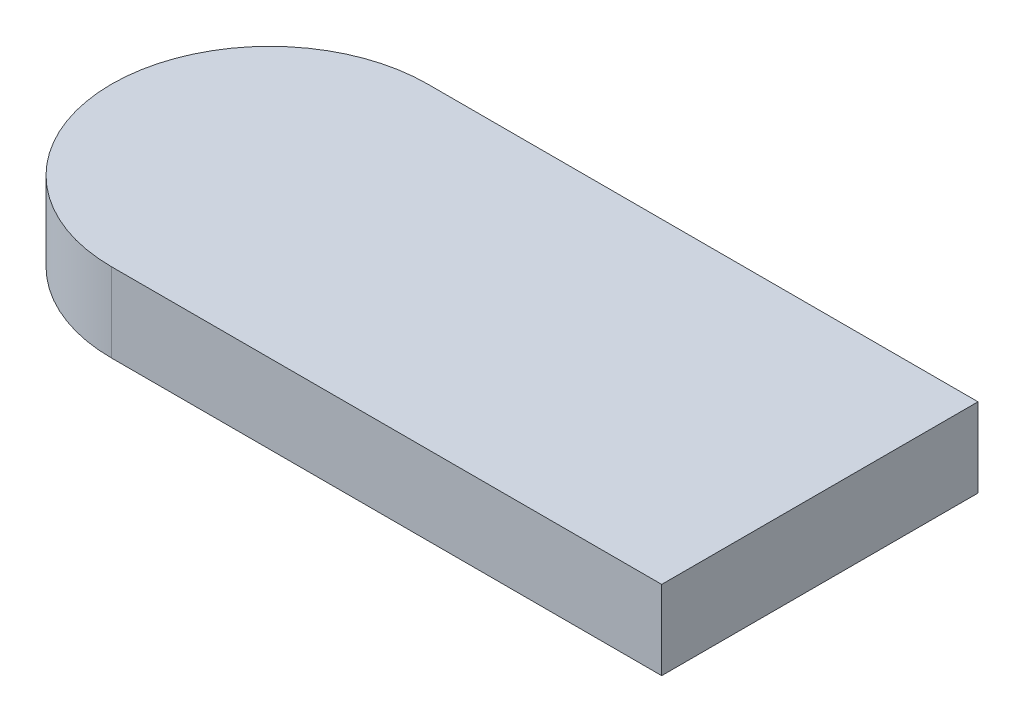
ISO-10303-21;
HEADER;
FILE_DESCRIPTION(('STEP AP214'),'2;1');
FILE_NAME('part.step','',(''),(''),'','','');
FILE_SCHEMA(('AUTOMOTIVE_DESIGN { 1 0 10303 214 1 1 1 1 }'));
ENDSEC;
DATA;
#1=APPLICATION_CONTEXT('core data for automotive mechanical design processes');
#2=APPLICATION_PROTOCOL_DEFINITION('international standard','automotive_design',2000,#1);
#3=PRODUCT_CONTEXT('',#1,'mechanical');
#4=PRODUCT('Part','Part','',(#3));
#5=PRODUCT_RELATED_PRODUCT_CATEGORY('part','',(#4));
#6=PRODUCT_DEFINITION_FORMATION('','',#4);
#7=PRODUCT_DEFINITION_CONTEXT('part definition',#1,'design');
#8=PRODUCT_DEFINITION('design','',#6,#7);
#9=PRODUCT_DEFINITION_SHAPE('','',#8);
#10=(LENGTH_UNIT() NAMED_UNIT(*) SI_UNIT(.MILLI.,.METRE.));
#11=(NAMED_UNIT(*) PLANE_ANGLE_UNIT() SI_UNIT($,.RADIAN.));
#12=(NAMED_UNIT(*) SI_UNIT($,.STERADIAN.) SOLID_ANGLE_UNIT());
#13=UNCERTAINTY_MEASURE_WITH_UNIT(LENGTH_MEASURE(1.E-05),#10,'distance_accuracy_value','');
#14=(GEOMETRIC_REPRESENTATION_CONTEXT(3) GLOBAL_UNCERTAINTY_ASSIGNED_CONTEXT((#13)) GLOBAL_UNIT_ASSIGNED_CONTEXT((#10,
#11,#12)) REPRESENTATION_CONTEXT('',''));
#15=CARTESIAN_POINT('',(0.,0.,0.));
#16=DIRECTION('',(0.,0.,1.));
#17=DIRECTION('',(1.,0.,0.));
#18=AXIS2_PLACEMENT_3D('',#15,#16,#17);
#19=CARTESIAN_POINT('',(20.77,5.97,11.94));
#20=DIRECTION('',(-1.,0.,0.));
#21=DIRECTION('',(0.,0.,1.));
#22=AXIS2_PLACEMENT_3D('',#19,#20,#21);
#23=PLANE('',#22);
#24=DIRECTION('',(0.,0.,-1.));
#25=VECTOR('',#24,1.);
#26=CARTESIAN_POINT('',(20.77,0.,11.94));
#27=LINE('',#26,#25);
#28=CARTESIAN_POINT('',(20.77,0.,11.94));
#29=VERTEX_POINT('',#28);
#30=CARTESIAN_POINT('',(20.77,0.,-11.94));
#31=VERTEX_POINT('',#30);
#32=EDGE_CURVE('E105',#29,#31,#27,.T.);
#33=ORIENTED_EDGE('',*,*,#32,.T.);
#34=DIRECTION('',(0.,-1.,0.));
#35=VECTOR('',#34,1.);
#36=CARTESIAN_POINT('',(20.77,5.97,-11.94));
#37=LINE('',#36,#35);
#38=CARTESIAN_POINT('',(20.77,5.97,-11.94));
#39=VERTEX_POINT('',#38);
#40=EDGE_CURVE('E11',#39,#31,#37,.T.);
#41=ORIENTED_EDGE('',*,*,#40,.F.);
#42=DIRECTION('',(0.,0.,-1.));
#43=VECTOR('',#42,1.);
#44=CARTESIAN_POINT('',(20.77,5.97,11.94));
#45=LINE('',#44,#43);
#46=CARTESIAN_POINT('',(20.77,5.97,11.94));
#47=VERTEX_POINT('',#46);
#48=EDGE_CURVE('E89',#47,#39,#45,.T.);
#49=ORIENTED_EDGE('',*,*,#48,.F.);
#50=DIRECTION('',(0.,-1.,0.));
#51=VECTOR('',#50,1.);
#52=CARTESIAN_POINT('',(20.77,5.97,11.94));
#53=LINE('',#52,#51);
#54=EDGE_CURVE('E98',#47,#29,#53,.T.);
#55=ORIENTED_EDGE('',*,*,#54,.T.);
#56=EDGE_LOOP('',(#33,#41,#49,#55));
#57=FACE_BOUND('',#56,.T.);
#58=ADVANCED_FACE('F39',(#57),#23,.F.);
#59=CARTESIAN_POINT('',(-20.77,5.97,-11.94));
#60=DIRECTION('',(0.,0.,1.));
#61=DIRECTION('',(1.,0.,0.));
#62=AXIS2_PLACEMENT_3D('',#59,#60,#61);
#63=PLANE('',#62);
#64=DIRECTION('',(-1.,0.,0.));
#65=VECTOR('',#64,1.);
#66=CARTESIAN_POINT('',(-20.77,0.,-11.94));
#67=LINE('',#66,#65);
#68=CARTESIAN_POINT('',(-20.77,0.,-11.94));
#69=VERTEX_POINT('',#68);
#70=EDGE_CURVE('E94',#31,#69,#67,.T.);
#71=ORIENTED_EDGE('',*,*,#70,.T.);
#72=DIRECTION('',(0.,-1.,0.));
#73=VECTOR('',#72,1.);
#74=CARTESIAN_POINT('',(-20.77,5.97,-11.94));
#75=LINE('',#74,#73);
#76=CARTESIAN_POINT('',(-20.77,5.97,-11.94));
#77=VERTEX_POINT('',#76);
#78=EDGE_CURVE('E50',#77,#69,#75,.T.);
#79=ORIENTED_EDGE('',*,*,#78,.F.);
#80=DIRECTION('',(-1.,0.,0.));
#81=VECTOR('',#80,1.);
#82=CARTESIAN_POINT('',(-20.77,5.97,-11.94));
#83=LINE('',#82,#81);
#84=EDGE_CURVE('E85',#39,#77,#83,.T.);
#85=ORIENTED_EDGE('',*,*,#84,.F.);
#86=ORIENTED_EDGE('',*,*,#40,.T.);
#87=EDGE_LOOP('',(#71,#79,#85,#86));
#88=FACE_BOUND('',#87,.T.);
#89=ADVANCED_FACE('F91',(#88),#63,.F.);
#90=CARTESIAN_POINT('',(-20.77,5.97,0.));
#91=DIRECTION('',(0.,-1.,0.));
#92=DIRECTION('',(0.,0.,-1.));
#93=AXIS2_PLACEMENT_3D('',#90,#91,#92);
#94=CYLINDRICAL_SURFACE('',#93,11.94);
#95=CARTESIAN_POINT('',(-20.77,0.,0.));
#96=DIRECTION('',(0.,1.,0.));
#97=DIRECTION('',(0.,0.,1.));
#98=AXIS2_PLACEMENT_3D('',#95,#96,#97);
#99=CIRCLE('',#98,11.94);
#100=CARTESIAN_POINT('',(-20.77,0.,11.94));
#101=VERTEX_POINT('',#100);
#102=EDGE_CURVE('E75',#69,#101,#99,.T.);
#103=ORIENTED_EDGE('',*,*,#102,.T.);
#104=DIRECTION('',(0.,-1.,0.));
#105=VECTOR('',#104,1.);
#106=CARTESIAN_POINT('',(-20.77,5.97,11.94));
#107=LINE('',#106,#105);
#108=CARTESIAN_POINT('',(-20.77,5.97,11.94));
#109=VERTEX_POINT('',#108);
#110=EDGE_CURVE('E92',#109,#101,#107,.T.);
#111=ORIENTED_EDGE('',*,*,#110,.F.);
#112=CARTESIAN_POINT('',(-20.77,5.97,0.));
#113=DIRECTION('',(0.,1.,0.));
#114=DIRECTION('',(0.,0.,1.));
#115=AXIS2_PLACEMENT_3D('',#112,#113,#114);
#116=CIRCLE('',#115,11.94);
#117=EDGE_CURVE('E86',#77,#109,#116,.T.);
#118=ORIENTED_EDGE('',*,*,#117,.F.);
#119=ORIENTED_EDGE('',*,*,#78,.T.);
#120=EDGE_LOOP('',(#103,#111,#118,#119));
#121=FACE_BOUND('',#120,.T.);
#122=ADVANCED_FACE('F96',(#121),#94,.T.);
#123=CARTESIAN_POINT('',(-20.77,5.97,11.94));
#124=DIRECTION('',(0.,0.,-1.));
#125=DIRECTION('',(-1.,0.,0.));
#126=AXIS2_PLACEMENT_3D('',#123,#124,#125);
#127=PLANE('',#126);
#128=DIRECTION('',(1.,0.,0.));
#129=VECTOR('',#128,1.);
#130=CARTESIAN_POINT('',(-20.77,0.,11.94));
#131=LINE('',#130,#129);
#132=EDGE_CURVE('E80',#101,#29,#131,.T.);
#133=ORIENTED_EDGE('',*,*,#132,.T.);
#134=ORIENTED_EDGE('',*,*,#54,.F.);
#135=DIRECTION('',(1.,0.,0.));
#136=VECTOR('',#135,1.);
#137=CARTESIAN_POINT('',(-20.77,5.97,11.94));
#138=LINE('',#137,#136);
#139=EDGE_CURVE('E54',#109,#47,#138,.T.);
#140=ORIENTED_EDGE('',*,*,#139,.F.);
#141=ORIENTED_EDGE('',*,*,#110,.T.);
#142=EDGE_LOOP('',(#133,#134,#140,#141));
#143=FACE_BOUND('',#142,.T.);
#144=ADVANCED_FACE('F108',(#143),#127,.F.);
#145=CARTESIAN_POINT('',(-20.77,5.97,0.));
#146=DIRECTION('',(0.,1.,0.));
#147=DIRECTION('',(0.,0.,1.));
#148=AXIS2_PLACEMENT_3D('',#145,#146,#147);
#149=PLANE('',#148);
#150=ORIENTED_EDGE('',*,*,#48,.T.);
#151=ORIENTED_EDGE('',*,*,#84,.T.);
#152=ORIENTED_EDGE('',*,*,#117,.T.);
#153=ORIENTED_EDGE('',*,*,#139,.T.);
#154=EDGE_LOOP('',(#150,#151,#152,#153));
#155=FACE_BOUND('',#154,.T.);
#156=ADVANCED_FACE('F88',(#155),#149,.T.);
#157=CARTESIAN_POINT('',(-20.77,0.,0.));
#158=DIRECTION('',(0.,1.,0.));
#159=DIRECTION('',(0.,0.,1.));
#160=AXIS2_PLACEMENT_3D('',#157,#158,#159);
#161=PLANE('',#160);
#162=ORIENTED_EDGE('',*,*,#32,.F.);
#163=ORIENTED_EDGE('',*,*,#132,.F.);
#164=ORIENTED_EDGE('',*,*,#102,.F.);
#165=ORIENTED_EDGE('',*,*,#70,.F.);
#166=EDGE_LOOP('',(#162,#163,#164,#165));
#167=FACE_BOUND('',#166,.T.);
#168=ADVANCED_FACE('F115',(#167),#161,.F.);
#169=CLOSED_SHELL('',(#58,#89,#122,#144,#156,#168));
#170=MANIFOLD_SOLID_BREP('B2',#169);
#171=ADVANCED_BREP_SHAPE_REPRESENTATION('',(#18,#170),#14);
#172=SHAPE_DEFINITION_REPRESENTATION(#9,#171);
ENDSEC;
END-ISO-10303-21;
